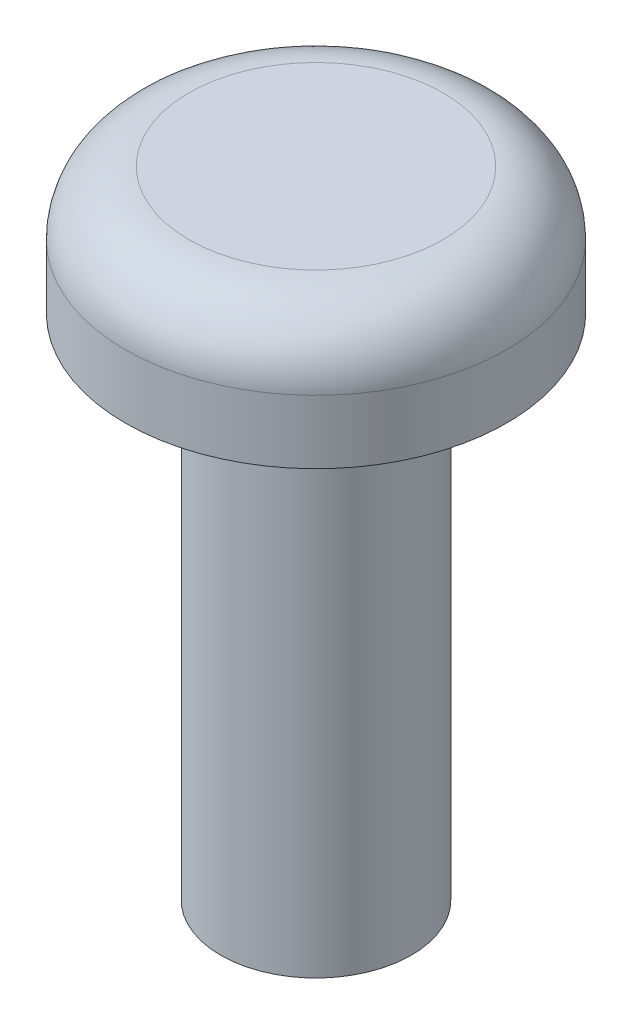
ISO-10303-21;
HEADER;
FILE_DESCRIPTION(('STEP AP214'),'2;1');
FILE_NAME('part.step','',(''),(''),'','','');
FILE_SCHEMA(('AUTOMOTIVE_DESIGN { 1 0 10303 214 1 1 1 1 }'));
ENDSEC;
DATA;
#1=APPLICATION_CONTEXT('core data for automotive mechanical design processes');
#2=APPLICATION_PROTOCOL_DEFINITION('international standard','automotive_design',2000,#1);
#3=PRODUCT_CONTEXT('',#1,'mechanical');
#4=PRODUCT('Part','Part','',(#3));
#5=PRODUCT_RELATED_PRODUCT_CATEGORY('part','',(#4));
#6=PRODUCT_DEFINITION_FORMATION('','',#4);
#7=PRODUCT_DEFINITION_CONTEXT('part definition',#1,'design');
#8=PRODUCT_DEFINITION('design','',#6,#7);
#9=PRODUCT_DEFINITION_SHAPE('','',#8);
#10=(LENGTH_UNIT() NAMED_UNIT(*) SI_UNIT(.MILLI.,.METRE.));
#11=(NAMED_UNIT(*) PLANE_ANGLE_UNIT() SI_UNIT($,.RADIAN.));
#12=(NAMED_UNIT(*) SI_UNIT($,.STERADIAN.) SOLID_ANGLE_UNIT());
#13=UNCERTAINTY_MEASURE_WITH_UNIT(LENGTH_MEASURE(1.E-05),#10,'distance_accuracy_value','');
#14=(GEOMETRIC_REPRESENTATION_CONTEXT(3) GLOBAL_UNCERTAINTY_ASSIGNED_CONTEXT((#13)) GLOBAL_UNIT_ASSIGNED_CONTEXT((#10,
#11,#12)) REPRESENTATION_CONTEXT('',''));
#15=CARTESIAN_POINT('',(0.,0.,0.));
#16=DIRECTION('',(0.,0.,1.));
#17=DIRECTION('',(1.,0.,0.));
#18=AXIS2_PLACEMENT_3D('',#15,#16,#17);
#19=CARTESIAN_POINT('',(0.,8.,0.));
#20=DIRECTION('',(0.,-1.,0.));
#21=DIRECTION('',(0.,0.,-1.));
#22=AXIS2_PLACEMENT_3D('',#19,#20,#21);
#23=CYLINDRICAL_SURFACE('',#22,1.5);
#24=CARTESIAN_POINT('',(0.,8.,0.));
#25=DIRECTION('',(0.,1.,0.));
#26=DIRECTION('',(0.,0.,1.));
#27=AXIS2_PLACEMENT_3D('',#24,#25,#26);
#28=CIRCLE('',#27,1.5);
#29=CARTESIAN_POINT('',(0.,8.,1.5));
#30=VERTEX_POINT('',#29);
#31=EDGE_CURVE('E42',#30,#30,#28,.T.);
#32=ORIENTED_EDGE('',*,*,#31,.F.);
#33=EDGE_LOOP('',(#32));
#34=FACE_BOUND('',#33,.T.);
#35=CARTESIAN_POINT('',(0.,0.,0.));
#36=DIRECTION('',(0.,1.,0.));
#37=DIRECTION('',(0.,0.,1.));
#38=AXIS2_PLACEMENT_3D('',#35,#36,#37);
#39=CIRCLE('',#38,1.5);
#40=CARTESIAN_POINT('',(0.,0.,1.5));
#41=VERTEX_POINT('',#40);
#42=EDGE_CURVE('E46',#41,#41,#39,.T.);
#43=ORIENTED_EDGE('',*,*,#42,.T.);
#44=EDGE_LOOP('',(#43));
#45=FACE_BOUND('',#44,.T.);
#46=ADVANCED_FACE('F31',(#34,#45),#23,.T.);
#47=CARTESIAN_POINT('',(0.,0.,0.));
#48=DIRECTION('',(0.,1.,0.));
#49=DIRECTION('',(0.,0.,1.));
#50=AXIS2_PLACEMENT_3D('',#47,#48,#49);
#51=PLANE('',#50);
#52=ORIENTED_EDGE('',*,*,#42,.F.);
#53=EDGE_LOOP('',(#52));
#54=FACE_BOUND('',#53,.T.);
#55=ADVANCED_FACE('F70',(#54),#51,.F.);
#56=CARTESIAN_POINT('',(0.,10.,0.));
#57=DIRECTION('',(0.,-1.,0.));
#58=DIRECTION('',(0.,0.,-1.));
#59=AXIS2_PLACEMENT_3D('',#56,#57,#58);
#60=CYLINDRICAL_SURFACE('',#59,3.);
#61=CARTESIAN_POINT('',(0.,9.,0.));
#62=DIRECTION('',(0.,1.,0.));
#63=DIRECTION('',(0.,0.,1.));
#64=AXIS2_PLACEMENT_3D('',#61,#62,#63);
#65=CIRCLE('',#64,3.);
#66=CARTESIAN_POINT('',(0.,9.,3.));
#67=VERTEX_POINT('',#66);
#68=EDGE_CURVE('E10',#67,#67,#65,.F.);
#69=ORIENTED_EDGE('',*,*,#68,.T.);
#70=EDGE_LOOP('',(#69));
#71=FACE_BOUND('',#70,.T.);
#72=CARTESIAN_POINT('',(0.,8.,0.));
#73=DIRECTION('',(0.,1.,0.));
#74=DIRECTION('',(0.,0.,1.));
#75=AXIS2_PLACEMENT_3D('',#72,#73,#74);
#76=CIRCLE('',#75,3.);
#77=CARTESIAN_POINT('',(0.,8.,3.));
#78=VERTEX_POINT('',#77);
#79=EDGE_CURVE('E50',#78,#78,#76,.T.);
#80=ORIENTED_EDGE('',*,*,#79,.T.);
#81=EDGE_LOOP('',(#80));
#82=FACE_BOUND('',#81,.T.);
#83=ADVANCED_FACE('F55',(#71,#82),#60,.T.);
#84=CARTESIAN_POINT('',(0.,10.,0.));
#85=DIRECTION('',(0.,1.,0.));
#86=DIRECTION('',(0.,0.,1.));
#87=AXIS2_PLACEMENT_3D('',#84,#85,#86);
#88=PLANE('',#87);
#89=CARTESIAN_POINT('',(0.,10.,0.));
#90=DIRECTION('',(0.,1.,0.));
#91=DIRECTION('',(0.,0.,1.));
#92=AXIS2_PLACEMENT_3D('',#89,#90,#91);
#93=CIRCLE('',#92,2.);
#94=CARTESIAN_POINT('',(0.,10.,2.));
#95=VERTEX_POINT('',#94);
#96=EDGE_CURVE('E38',#95,#95,#93,.T.);
#97=ORIENTED_EDGE('',*,*,#96,.T.);
#98=EDGE_LOOP('',(#97));
#99=FACE_BOUND('',#98,.T.);
#100=ADVANCED_FACE('F59',(#99),#88,.T.);
#101=CARTESIAN_POINT('',(0.,8.,0.));
#102=DIRECTION('',(0.,1.,0.));
#103=DIRECTION('',(0.,0.,1.));
#104=AXIS2_PLACEMENT_3D('',#101,#102,#103);
#105=PLANE('',#104);
#106=ORIENTED_EDGE('',*,*,#31,.T.);
#107=EDGE_LOOP('',(#106));
#108=FACE_BOUND('',#107,.T.);
#109=ORIENTED_EDGE('',*,*,#79,.F.);
#110=EDGE_LOOP('',(#109));
#111=FACE_BOUND('',#110,.T.);
#112=ADVANCED_FACE('F57',(#108,#111),#105,.F.);
#113=CARTESIAN_POINT('',(0.,9.,0.));
#114=DIRECTION('',(0.,1.,0.));
#115=DIRECTION('',(0.,0.,1.));
#116=AXIS2_PLACEMENT_3D('',#113,#114,#115);
#117=TOROIDAL_SURFACE('',#116,2.,1.);
#118=ORIENTED_EDGE('',*,*,#68,.F.);
#119=EDGE_LOOP('',(#118));
#120=FACE_BOUND('',#119,.T.);
#121=ORIENTED_EDGE('',*,*,#96,.F.);
#122=EDGE_LOOP('',(#121));
#123=FACE_BOUND('',#122,.T.);
#124=ADVANCED_FACE('F33',(#120,#123),#117,.T.);
#125=CLOSED_SHELL('',(#46,#55,#83,#100,#112,#124));
#126=MANIFOLD_SOLID_BREP('B2',#125);
#127=ADVANCED_BREP_SHAPE_REPRESENTATION('',(#18,#126),#14);
#128=SHAPE_DEFINITION_REPRESENTATION(#9,#127);
ENDSEC;
END-ISO-10303-21;
